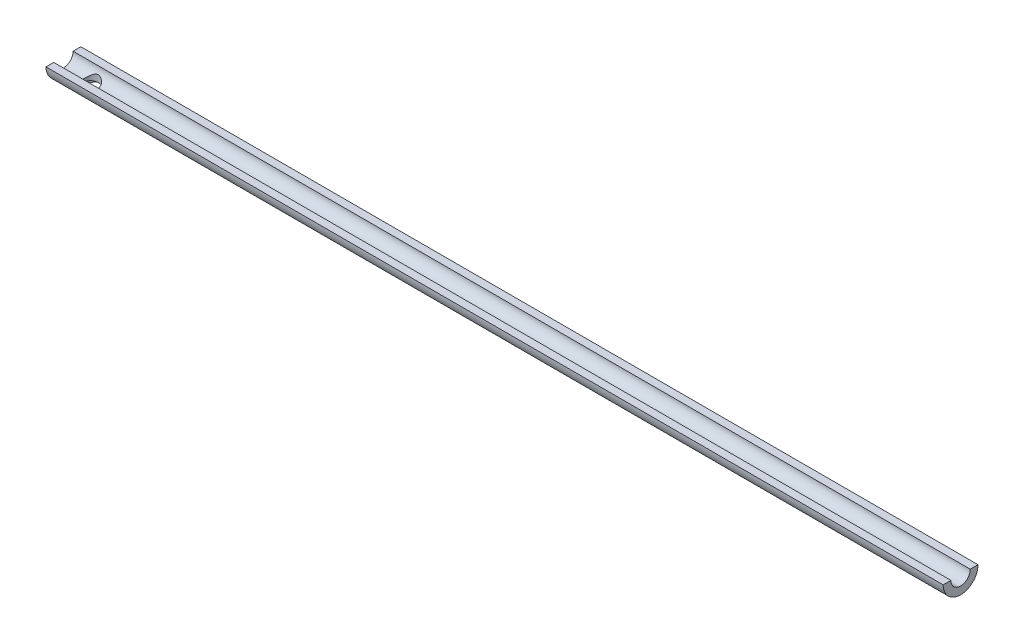
ISO-10303-21;
HEADER;
FILE_DESCRIPTION(('STEP AP214'),'2;1');
FILE_NAME('part.step','',(''),(''),'','','');
FILE_SCHEMA(('AUTOMOTIVE_DESIGN { 1 0 10303 214 1 1 1 1 }'));
ENDSEC;
DATA;
#1=APPLICATION_CONTEXT('core data for automotive mechanical design processes');
#2=APPLICATION_PROTOCOL_DEFINITION('international standard','automotive_design',2000,#1);
#3=PRODUCT_CONTEXT('',#1,'mechanical');
#4=PRODUCT('Part','Part','',(#3));
#5=PRODUCT_RELATED_PRODUCT_CATEGORY('part','',(#4));
#6=PRODUCT_DEFINITION_FORMATION('','',#4);
#7=PRODUCT_DEFINITION_CONTEXT('part definition',#1,'design');
#8=PRODUCT_DEFINITION('design','',#6,#7);
#9=PRODUCT_DEFINITION_SHAPE('','',#8);
#10=(LENGTH_UNIT() NAMED_UNIT(*) SI_UNIT(.MILLI.,.METRE.));
#11=(NAMED_UNIT(*) PLANE_ANGLE_UNIT() SI_UNIT($,.RADIAN.));
#12=(NAMED_UNIT(*) SI_UNIT($,.STERADIAN.) SOLID_ANGLE_UNIT());
#13=UNCERTAINTY_MEASURE_WITH_UNIT(LENGTH_MEASURE(1.E-05),#10,'distance_accuracy_value','');
#14=(GEOMETRIC_REPRESENTATION_CONTEXT(3) GLOBAL_UNCERTAINTY_ASSIGNED_CONTEXT((#13)) GLOBAL_UNIT_ASSIGNED_CONTEXT((#10,
#11,#12)) REPRESENTATION_CONTEXT('',''));
#15=CARTESIAN_POINT('',(0.,0.,0.));
#16=DIRECTION('',(0.,0.,1.));
#17=DIRECTION('',(1.,0.,0.));
#18=AXIS2_PLACEMENT_3D('',#15,#16,#17);
#19=CARTESIAN_POINT('',(735.584,15.875,0.));
#20=DIRECTION('',(-1.,0.,0.));
#21=DIRECTION('',(0.,0.,1.));
#22=AXIS2_PLACEMENT_3D('',#19,#20,#21);
#23=PLANE('',#22);
#24=CARTESIAN_POINT('',(735.584,15.875,-19.05));
#25=DIRECTION('',(-1.,0.,0.));
#26=DIRECTION('',(0.,0.,1.));
#27=AXIS2_PLACEMENT_3D('',#24,#25,#26);
#28=CIRCLE('',#27,14.2875);
#29=CARTESIAN_POINT('',(735.584,15.875,-33.3375));
#30=VERTEX_POINT('',#29);
#31=CARTESIAN_POINT('',(735.584,15.875,-4.7625));
#32=VERTEX_POINT('',#31);
#33=EDGE_CURVE('E65',#30,#32,#28,.T.);
#34=ORIENTED_EDGE('',*,*,#33,.F.);
#35=DIRECTION('',(0.,0.,-1.));
#36=VECTOR('',#35,1.);
#37=CARTESIAN_POINT('',(735.584,15.875,0.));
#38=LINE('',#37,#36);
#39=CARTESIAN_POINT('',(735.584,15.875,-26.9875));
#40=VERTEX_POINT('',#39);
#41=EDGE_CURVE('E105',#40,#30,#38,.T.);
#42=ORIENTED_EDGE('',*,*,#41,.F.);
#43=CARTESIAN_POINT('',(735.584,15.875,-19.05));
#44=DIRECTION('',(1.,0.,0.));
#45=DIRECTION('',(0.,0.,-1.));
#46=AXIS2_PLACEMENT_3D('',#43,#44,#45);
#47=CIRCLE('',#46,7.9375);
#48=CARTESIAN_POINT('',(735.584,15.875,-11.1125));
#49=VERTEX_POINT('',#48);
#50=EDGE_CURVE('E116',#49,#40,#47,.T.);
#51=ORIENTED_EDGE('',*,*,#50,.F.);
#52=EDGE_CURVE('E103',#32,#49,#38,.T.);
#53=ORIENTED_EDGE('',*,*,#52,.F.);
#54=EDGE_LOOP('',(#34,#42,#51,#53));
#55=FACE_BOUND('',#54,.T.);
#56=ADVANCED_FACE('F37',(#55),#23,.F.);
#57=CARTESIAN_POINT('',(0.,15.875,0.));
#58=DIRECTION('',(0.,-1.,0.));
#59=DIRECTION('',(0.,0.,-1.));
#60=AXIS2_PLACEMENT_3D('',#57,#58,#59);
#61=PLANE('',#60);
#62=DIRECTION('',(-1.,0.,0.));
#63=VECTOR('',#62,1.);
#64=CARTESIAN_POINT('',(735.584,15.875,-33.3375));
#65=LINE('',#64,#63);
#66=CARTESIAN_POINT('',(0.,15.875,-33.3375));
#67=VERTEX_POINT('',#66);
#68=EDGE_CURVE('E86',#67,#30,#65,.F.);
#69=ORIENTED_EDGE('',*,*,#68,.F.);
#70=DIRECTION('',(0.,0.,1.));
#71=VECTOR('',#70,1.);
#72=CARTESIAN_POINT('',(0.,15.875,0.));
#73=LINE('',#72,#71);
#74=CARTESIAN_POINT('',(0.,15.875,-26.9875));
#75=VERTEX_POINT('',#74);
#76=EDGE_CURVE('E106',#67,#75,#73,.T.);
#77=ORIENTED_EDGE('',*,*,#76,.T.);
#78=DIRECTION('',(1.,0.,0.));
#79=VECTOR('',#78,1.);
#80=CARTESIAN_POINT('',(0.,15.875,-26.9875));
#81=LINE('',#80,#79);
#82=EDGE_CURVE('E12',#75,#40,#81,.T.);
#83=ORIENTED_EDGE('',*,*,#82,.T.);
#84=ORIENTED_EDGE('',*,*,#41,.T.);
#85=EDGE_LOOP('',(#69,#77,#83,#84));
#86=FACE_BOUND('',#85,.T.);
#87=ADVANCED_FACE('F104',(#86),#61,.F.);
#88=DIRECTION('',(-1.,0.,0.));
#89=VECTOR('',#88,1.);
#90=CARTESIAN_POINT('',(735.584,15.875,-4.7625));
#91=LINE('',#90,#89);
#92=CARTESIAN_POINT('',(0.,15.875,-4.7625));
#93=VERTEX_POINT('',#92);
#94=EDGE_CURVE('E96',#32,#93,#91,.T.);
#95=ORIENTED_EDGE('',*,*,#94,.F.);
#96=ORIENTED_EDGE('',*,*,#52,.T.);
#97=DIRECTION('',(1.,0.,0.));
#98=VECTOR('',#97,1.);
#99=CARTESIAN_POINT('',(0.,15.875,-11.1125));
#100=LINE('',#99,#98);
#101=CARTESIAN_POINT('',(0.,15.875,-11.1125));
#102=VERTEX_POINT('',#101);
#103=EDGE_CURVE('E53',#49,#102,#100,.F.);
#104=ORIENTED_EDGE('',*,*,#103,.T.);
#105=EDGE_CURVE('E107',#102,#93,#73,.T.);
#106=ORIENTED_EDGE('',*,*,#105,.T.);
#107=EDGE_LOOP('',(#95,#96,#104,#106));
#108=FACE_BOUND('',#107,.T.);
#109=ADVANCED_FACE('F134',(#108),#61,.F.);
#110=CARTESIAN_POINT('',(22.225,5.5499,-19.05));
#111=DIRECTION('',(0.,-1.,0.));
#112=DIRECTION('',(0.,0.,-1.));
#113=AXIS2_PLACEMENT_3D('',#110,#111,#112);
#114=CYLINDRICAL_SURFACE('',#113,8.128);
#115=CARTESIAN_POINT('',(22.225,5.5499,-19.05));
#116=DIRECTION('',(0.,-1.,0.));
#117=DIRECTION('',(0.,0.,-1.));
#118=AXIS2_PLACEMENT_3D('',#115,#116,#117);
#119=CIRCLE('',#118,8.128);
#120=CARTESIAN_POINT('',(22.225,5.5499,-27.178));
#121=VERTEX_POINT('',#120);
#122=EDGE_CURVE('E180',#121,#121,#119,.T.);
#123=ORIENTED_EDGE('',*,*,#122,.F.);
#124=EDGE_LOOP('',(#123));
#125=FACE_BOUND('',#124,.T.);
#126=CARTESIAN_POINT('',(22.225,4.12475437490772,-27.178));
#127=CARTESIAN_POINT('',(22.0180147532059,4.1247532803757,-27.1779992237774));
#128=CARTESIAN_POINT('',(21.8110182894372,4.11926483692695,-27.1700813911082));
#129=CARTESIAN_POINT('',(21.3987922198779,4.09754245588704,-27.1385418085654));
#130=CARTESIAN_POINT('',(21.1935627571081,4.08130765661839,-27.1149187993993));
#131=CARTESIAN_POINT('',(20.7863878615931,4.03874877782049,-27.0523271400779));
#132=CARTESIAN_POINT('',(20.5844447959058,4.01241773491488,-27.0133478982228));
#133=CARTESIAN_POINT('',(20.1853282556612,3.95067075075943,-26.920586092574));
#134=CARTESIAN_POINT('',(19.988157024114,3.91525062456957,-26.8667967088247));
#135=CARTESIAN_POINT('',(19.6012008031054,3.83685509724765,-26.745511165725));
#136=CARTESIAN_POINT('',(19.4113740403267,3.79393385173565,-26.6781127509178));
#137=CARTESIAN_POINT('',(19.0385167877705,3.7016974888775,-26.5300382259267));
#138=CARTESIAN_POINT('',(18.8554888516306,3.6523799997255,-26.4493571873782));
#139=CARTESIAN_POINT('',(18.4970035159903,3.54873604210493,-26.2753794395942));
#140=CARTESIAN_POINT('',(18.3215461204565,3.49440957101198,-26.1820827237488));
#141=CARTESIAN_POINT('',(17.9788353795059,3.38212322601149,-25.9835226420731));
#142=CARTESIAN_POINT('',(17.8115823141774,3.32416322821229,-25.8782588681046));
#143=CARTESIAN_POINT('',(17.2873582640215,3.13391765196363,-25.5210848460265));
#144=CARTESIAN_POINT('',(16.946984312011,2.99695023811273,-25.2464934731679));
#145=CARTESIAN_POINT('',(16.472669066792,2.79305720220681,-24.7965425661813));
#146=CARTESIAN_POINT('',(16.3205174293569,2.72530880154062,-24.6401003216129));
#147=CARTESIAN_POINT('',(16.0288266458558,2.59177681487287,-24.3149290275969));
#148=CARTESIAN_POINT('',(15.8892896853653,2.52599357066447,-24.1461978581212));
#149=CARTESIAN_POINT('',(15.6112113719546,2.39188965528202,-23.7807265060997));
#150=CARTESIAN_POINT('',(15.4740014746693,2.32391350337649,-23.5828450606214));
#151=CARTESIAN_POINT('',(15.2169626423935,2.19404365322446,-23.1743177307861));
#152=CARTESIAN_POINT('',(15.0971260526265,2.13214728009375,-22.963677526368));
#153=CARTESIAN_POINT('',(14.8760572788859,2.01619860561373,-22.5308687873104));
#154=CARTESIAN_POINT('',(14.7748183059184,1.96214344338009,-22.3087044976281));
#155=CARTESIAN_POINT('',(14.592178921927,1.86349332974293,-21.8543445193544));
#156=CARTESIAN_POINT('',(14.5107756478608,1.81889701319039,-21.6221502841663));
#157=CARTESIAN_POINT('',(14.375223971502,1.74402848766091,-21.170385845118));
#158=CARTESIAN_POINT('',(14.3193106352917,1.71284266792939,-20.9514960729174));
#159=CARTESIAN_POINT('',(14.2257583035214,1.66040767567717,-20.5086681999183));
#160=CARTESIAN_POINT('',(14.1881183305758,1.63915797170662,-20.2847303697953));
#161=CARTESIAN_POINT('',(14.1317025233993,1.60723228622229,-19.8338970737274));
#162=CARTESIAN_POINT('',(14.1129137486965,1.59654905138997,-19.6070037451223));
#163=CARTESIAN_POINT('',(14.0944574588793,1.58605556350154,-19.152197221018));
#164=CARTESIAN_POINT('',(14.0947882780549,1.58624436326758,-18.9242841160921));
#165=CARTESIAN_POINT('',(14.1134480106352,1.59685216207865,-18.4950597861182));
#166=CARTESIAN_POINT('',(14.1297567730494,1.60612288849519,-18.2936283829412));
#167=CARTESIAN_POINT('',(14.1772302026522,1.63300272114614,-17.8930847861401));
#168=CARTESIAN_POINT('',(14.2083948904262,1.6506118389348,-17.6939725957299));
#169=CARTESIAN_POINT('',(14.285205100033,1.6937586086349,-17.2994481376163));
#170=CARTESIAN_POINT('',(14.330850422873,1.71929615159389,-17.1040358191084));
#171=CARTESIAN_POINT('',(14.4361090438978,1.77772437070963,-16.7181404779157));
#172=CARTESIAN_POINT('',(14.4957228984782,1.81061533976627,-16.5276576519185));
#173=CARTESIAN_POINT('',(14.6289037163109,1.883366444814,-16.151044574491));
#174=CARTESIAN_POINT('',(14.7025895729946,1.92328572021973,-15.9649678088723));
#175=CARTESIAN_POINT('',(14.8628859216692,2.00905516258062,-15.5998607105857));
#176=CARTESIAN_POINT('',(14.9495007436819,2.05490731581992,-15.420832764111));
#177=CARTESIAN_POINT('',(15.2276890928379,2.20000547802107,-14.8956302559676));
#178=CARTESIAN_POINT('',(15.4376919804277,2.30684115966405,-14.5610979019035));
#179=CARTESIAN_POINT('',(15.9273094610793,2.54539424455193,-13.8930550781077));
#180=CARTESIAN_POINT('',(16.2120962339968,2.67855865345796,-13.5638891046657));
#181=CARTESIAN_POINT('',(16.8300430009505,2.94841747384691,-12.9551675557189));
#182=CARTESIAN_POINT('',(17.1632609297996,3.08511594956813,-12.6756723006394));
#183=CARTESIAN_POINT('',(17.7123785400368,3.28931712151679,-12.285552451061));
#184=CARTESIAN_POINT('',(17.9135239179696,3.3602555712769,-12.1555659656631));
#185=CARTESIAN_POINT('',(18.3279364553059,3.49690988125253,-11.9131328407156));
#186=CARTESIAN_POINT('',(18.5412052632069,3.56262502829579,-11.8006885943137));
#187=CARTESIAN_POINT('',(18.9784190779849,3.68628936956866,-11.5946376821911));
#188=CARTESIAN_POINT('',(19.2023480558645,3.74424975339225,-11.5010037743509));
#189=CARTESIAN_POINT('',(19.6597889977331,3.85006144936678,-11.3335671871596));
#190=CARTESIAN_POINT('',(19.8932976168246,3.89791625477487,-11.2597576525893));
#191=CARTESIAN_POINT('',(20.3141247550129,3.97176227899168,-11.147531505603));
#192=CARTESIAN_POINT('',(20.4998869661831,4.00025064127314,-11.1048837500096));
#193=CARTESIAN_POINT('',(20.8749901106291,4.04891667287766,-11.032624119537));
#194=CARTESIAN_POINT('',(21.0643303425699,4.06909595356551,-11.0030097170471));
#195=CARTESIAN_POINT('',(21.4452238519753,4.10043715333412,-10.9572193397773));
#196=CARTESIAN_POINT('',(21.6367752842204,4.11160610746744,-10.9410328804927));
#197=CARTESIAN_POINT('',(22.0208703931804,4.12454872876364,-10.922289176426));
#198=CARTESIAN_POINT('',(22.2134140953366,4.12632215381884,-10.9197322828558));
#199=CARTESIAN_POINT('',(22.5981461721252,4.12040541837536,-10.9282890627355));
#200=CARTESIAN_POINT('',(22.7903343200902,4.11271051065841,-10.9394095937503));
#201=CARTESIAN_POINT('',(23.1728480072731,4.08813218458613,-10.9751705709717));
#202=CARTESIAN_POINT('',(23.3631735398583,4.0712487335235,-10.9998110653035));
#203=CARTESIAN_POINT('',(23.7407450063913,4.02888080940674,-11.062288437456));
#204=CARTESIAN_POINT('',(23.9279896141035,4.00339272894072,-11.1001308502822));
#205=CARTESIAN_POINT('',(24.2982642769525,3.94464973717565,-11.1885617223697));
#206=CARTESIAN_POINT('',(24.4812926013519,3.91139169667847,-11.2391553175666));
#207=CARTESIAN_POINT('',(24.844494847235,3.83764193152166,-11.3532904310791));
#208=CARTESIAN_POINT('',(25.0246000490354,3.79706122163712,-11.4169927594608));
#209=CARTESIAN_POINT('',(25.3787080656639,3.71010547664289,-11.5563533307756));
#210=CARTESIAN_POINT('',(25.5527088431555,3.6637285301769,-11.6320155197594));
#211=CARTESIAN_POINT('',(26.0645284851636,3.51767962655346,-11.8760720749144));
#212=CARTESIAN_POINT('',(26.3923325093595,3.41105365305769,-12.061589808659));
#213=CARTESIAN_POINT('',(27.0686900250849,3.17013197155076,-12.508338747979));
#214=CARTESIAN_POINT('',(27.4117498844501,3.03417303350307,-12.7770107658701));
#215=CARTESIAN_POINT('',(27.8909516798366,2.83082797521136,-13.2183070688705));
#216=CARTESIAN_POINT('',(28.0448883261136,2.76309531190179,-13.3719150091513));
#217=CARTESIAN_POINT('',(28.3403524753679,2.6293049873683,-13.6914386250406));
#218=CARTESIAN_POINT('',(28.4818779387584,2.56324760271373,-13.8573563153278));
#219=CARTESIAN_POINT('',(28.7648784244889,2.42801685551445,-14.2176239858584));
#220=CARTESIAN_POINT('',(28.9049937562794,2.35917096368468,-14.4131675097714));
#221=CARTESIAN_POINT('',(29.1680510426809,2.22724240655099,-14.8172109410428));
#222=CARTESIAN_POINT('',(29.2910003725608,2.16415727022872,-15.0257052282056));
#223=CARTESIAN_POINT('',(29.5185153802836,2.04553079179035,-15.4544625311531));
#224=CARTESIAN_POINT('',(29.623087585257,1.9899867728441,-15.6747213320632));
#225=CARTESIAN_POINT('',(29.8126114017301,1.88808715215838,-16.1255674144062));
#226=CARTESIAN_POINT('',(29.8975657204929,1.84173028272008,-16.356153265459));
#227=CARTESIAN_POINT('',(30.0405319279167,1.76303511449334,-16.8065627144205));
#228=CARTESIAN_POINT('',(30.1001807373834,1.72985955165364,-17.0257206954869));
#229=CARTESIAN_POINT('',(30.2010980032451,1.6734276457378,-17.4694910599292));
#230=CARTESIAN_POINT('',(30.2423673439576,1.65017082542945,-17.694103180334));
#231=CARTESIAN_POINT('',(30.3058771817978,1.61427905051082,-18.1466803103593));
#232=CARTESIAN_POINT('',(30.328131386229,1.6016364446235,-18.3746427840472));
#233=CARTESIAN_POINT('',(30.3533008556728,1.58733273321917,-18.8319685103891));
#234=CARTESIAN_POINT('',(30.3562179535954,1.58567058689532,-19.0613316282171));
#235=CARTESIAN_POINT('',(30.3434555646966,1.59292805827617,-19.4929113254883));
#236=CARTESIAN_POINT('',(30.329877594262,1.6006519084853,-19.6952143027216));
#237=CARTESIAN_POINT('',(30.2877260874705,1.62454313495614,-20.0977497224463));
#238=CARTESIAN_POINT('',(30.259152613769,1.64071047593858,-20.2979821735855));
#239=CARTESIAN_POINT('',(30.1873597538179,1.6811081377679,-20.6949623606104));
#240=CARTESIAN_POINT('',(30.1441407301919,1.70533825898019,-20.8917101826484));
#241=CARTESIAN_POINT('',(30.0435525296171,1.76130836593261,-21.2804571592908));
#242=CARTESIAN_POINT('',(29.9861828292883,1.79304862944265,-21.4724561379644));
#243=CARTESIAN_POINT('',(29.8577103118146,1.86344616022037,-21.8511049285758));
#244=CARTESIAN_POINT('',(29.7865700609654,1.90212226021264,-22.0377385298514));
#245=CARTESIAN_POINT('',(29.6313250934355,1.9855200799614,-22.4041579276078));
#246=CARTESIAN_POINT('',(29.547216049953,2.03024381678706,-22.5839414136153));
#247=CARTESIAN_POINT('',(29.2764762262614,2.17215934525449,-23.1116732419864));
#248=CARTESIAN_POINT('',(29.0713476266087,2.27714337546833,-23.448251074376));
#249=CARTESIAN_POINT('',(28.5924271313372,2.51221039405393,-24.1204134915682));
#250=CARTESIAN_POINT('',(28.3135686743286,2.64378358838054,-24.4518300479086));
#251=CARTESIAN_POINT('',(27.7075374404192,2.91149202465902,-25.066008590855));
#252=CARTESIAN_POINT('',(27.380307034293,3.04763255637928,-25.3487116591085));
#253=CARTESIAN_POINT('',(26.8397096345114,3.25231241551686,-25.7452001411438));
#254=CARTESIAN_POINT('',(26.6410517451605,3.32379995190781,-25.8779005695173));
#255=CARTESIAN_POINT('',(26.2314938118909,3.46197839661398,-26.1259932134789));
#256=CARTESIAN_POINT('',(26.0205920153576,3.52866861515832,-26.2413829426684));
#257=CARTESIAN_POINT('',(25.5879373800307,3.65473552688157,-26.4535817018082));
#258=CARTESIAN_POINT('',(25.3662003977546,3.71412248496211,-26.5504169199846));
#259=CARTESIAN_POINT('',(24.9129075625092,3.82324468480013,-26.7245307380687));
#260=CARTESIAN_POINT('',(24.6813552048321,3.87298332775522,-26.801816232523));
#261=CARTESIAN_POINT('',(24.2671813550624,3.9499023117823,-26.9194578131634));
#262=CARTESIAN_POINT('',(24.0862738513112,3.97962899667628,-26.9642247084879));
#263=CARTESIAN_POINT('',(23.7207562828793,4.03131583410353,-27.0413681658742));
#264=CARTESIAN_POINT('',(23.5361469383456,4.05327748203223,-27.073747113713));
#265=CARTESIAN_POINT('',(23.164458579354,4.08870874786635,-27.1257035236378));
#266=CARTESIAN_POINT('',(22.9773814513257,4.10218450749925,-27.1452902445796));
#267=CARTESIAN_POINT('',(22.6018727277906,4.1202082191966,-27.1714394195515));
#268=CARTESIAN_POINT('',(22.4134410124486,4.12475537137837,-27.1780007066792));
#269=CARTESIAN_POINT('',(22.225,4.12475437490772,-27.178));
#270=B_SPLINE_CURVE_WITH_KNOTS('',3,(#126,#127,#128,#129,#130,#131,#132,#133,#134,#135,#136,
#137,#138,#139,#140,#141,#142,#143,#144,#145,#146,#147,#148,#149,#150,#151,#152,#153,#154,#155,
#156,#157,#158,#159,#160,#161,#162,#163,#164,#165,#166,#167,#168,#169,#170,#171,#172,#173,#174,
#175,#176,#177,#178,#179,#180,#181,#182,#183,#184,#185,#186,#187,#188,#189,#190,#191,#192,#193,
#194,#195,#196,#197,#198,#199,#200,#201,#202,#203,#204,#205,#206,#207,#208,#209,#210,#211,#212,
#213,#214,#215,#216,#217,#218,#219,#220,#221,#222,#223,#224,#225,#226,#227,#228,#229,#230,#231,
#232,#233,#234,#235,#236,#237,#238,#239,#240,#241,#242,#243,#244,#245,#246,#247,#248,#249,#250,
#251,#252,#253,#254,#255,#256,#257,#258,#259,#260,#261,#262,#263,#264,#265,#266,#267,#268,#269),
.UNSPECIFIED.,.T.,.F.,(4,2,2,2,2,2,2,2,2,2,2,2,2,2,2,2,2,2,2,2,2,2,2,2,2,2,2,2,2,2,2,2,2,2,2,2,
2,2,2,2,2,2,2,2,2,2,2,2,2,2,2,2,2,2,2,2,2,2,2,2,2,2,2,2,2,2,2,2,2,2,2,4),(0.,0.620754127397335,
1.24155803489433,1.86279088308009,2.48431028401051,3.10151510056483,3.71894944213898,
4.33638410720971,4.95383983629194,6.32207699198678,7.0070909176564,7.69222329994257,
8.44188180863365,9.19120900314588,9.94026211248618,10.6892070409743,11.3724245891144,
12.0556055900344,12.7383172974124,13.4209695266473,14.0271565984417,14.6333445102122,
15.2395240921138,15.8457278235166,16.457300101753,17.069077662278,18.2918655983163,
19.6521467844397,21.0140687809612,21.7625974992275,22.5112282441642,23.2587668400916,
24.0060466052428,24.5835815681624,25.161004477988,25.737976111966,26.3149626135041,
26.8922385215696,27.4695164845053,28.0470367670997,28.624790036755,29.2101056428332,
29.7956147733005,30.9660989876605,32.329617069885,33.0123866851701,33.6952682936899,
34.4449625332793,35.1943336735009,35.943438114087,36.6924391166014,37.3800868041914,
38.0677014024412,38.7548199057505,39.4418732780968,40.0498584890229,40.6578411596363,
41.2658087777079,41.8737988855684,42.4834655652482,43.0933360910135,44.3122855860784,
45.6650948400749,47.0195289870142,47.7668485354288,48.5142753215082,49.2606392749048,
50.0067396420717,50.5723472476314,51.1378458687382,51.7029347339975,52.2680742212807),.UNSPECIFIED.);
#271=CARTESIAN_POINT('',(22.225,4.12475437490772,-27.178));
#272=VERTEX_POINT('',#271);
#273=EDGE_CURVE('E136',#272,#272,#270,.T.);
#274=ORIENTED_EDGE('',*,*,#273,.F.);
#275=EDGE_LOOP('',(#274));
#276=FACE_BOUND('',#275,.T.);
#277=ADVANCED_FACE('F129',(#125,#276),#114,.F.);
#278=CARTESIAN_POINT('',(22.225,15.875,-19.05));
#279=DIRECTION('',(0.,-1.,0.));
#280=DIRECTION('',(0.,0.,-1.));
#281=AXIS2_PLACEMENT_3D('',#278,#279,#280);
#282=CYLINDRICAL_SURFACE('',#281,6.35);
#283=CARTESIAN_POINT('',(22.225,11.1125,-25.4));
#284=CARTESIAN_POINT('',(22.1057591384843,11.1124972219549,-25.3999988458941));
#285=CARTESIAN_POINT('',(21.9864748221275,11.1079993597814,-25.3966322226424));
#286=CARTESIAN_POINT('',(21.7488907056395,11.0902297345786,-25.3832454421482));
#287=CARTESIAN_POINT('',(21.6305916325855,11.0769519886551,-25.373220747862));
#288=CARTESIAN_POINT('',(21.3956326538325,11.0422244649837,-25.3467183488856));
#289=CARTESIAN_POINT('',(21.2789776740302,11.0207540188557,-25.3302243205294));
#290=CARTESIAN_POINT('',(21.0482322748224,10.9705645850597,-25.2911079734667));
#291=CARTESIAN_POINT('',(20.9341436187361,10.9418407698869,-25.2684815726006));
#292=CARTESIAN_POINT('',(20.6698149950906,10.8671250091594,-25.2085803850203));
#293=CARTESIAN_POINT('',(20.5208230817188,10.8186030878779,-25.1689484172837));
#294=CARTESIAN_POINT('',(20.2289745443959,10.7129272316712,-25.0800639867922));
#295=CARTESIAN_POINT('',(20.0861181200141,10.6557730162358,-25.0308112113897));
#296=CARTESIAN_POINT('',(19.8062660642576,10.5349899459523,-24.9232234692227));
#297=CARTESIAN_POINT('',(19.669285792068,10.4713454366179,-24.8648663544885));
#298=CARTESIAN_POINT('',(19.4015035032551,10.3396631652094,-24.7396585029541));
#299=CARTESIAN_POINT('',(19.2707013299446,10.2716255146565,-24.67280798172));
#300=CARTESIAN_POINT('',(18.9689123311058,10.1076666116393,-24.5052741617836));
#301=CARTESIAN_POINT('',(18.8004994083019,10.0105595449506,-24.4010983926801));
#302=CARTESIAN_POINT('',(18.4747411758871,9.81455900031779,-24.1780631831489));
#303=CARTESIAN_POINT('',(18.3173998706645,9.71566489212355,-24.0591984724233));
#304=CARTESIAN_POINT('',(18.0141745830674,9.51896622305511,-23.8071297364857));
#305=CARTESIAN_POINT('',(17.8682815003554,9.42116085091244,-23.6739373044144));
#306=CARTESIAN_POINT('',(17.5884520150845,9.22905033185359,-23.3932895774403));
#307=CARTESIAN_POINT('',(17.4545116369805,9.13474402726844,-23.2458390591218));
#308=CARTESIAN_POINT('',(17.2247252749737,8.9699959351478,-22.9673449195798));
#309=CARTESIAN_POINT('',(17.1265784648234,8.8985179083313,-22.838807636718));
#310=CARTESIAN_POINT('',(16.9392996888609,8.76050584730411,-22.5728278495661));
#311=CARTESIAN_POINT('',(16.8501659790643,8.69397085730703,-22.435387076528));
#312=CARTESIAN_POINT('',(16.6818224419905,8.5671160758903,-22.1520641335981));
#313=CARTESIAN_POINT('',(16.6026009502199,8.50678899426989,-22.0061921867114));
#314=CARTESIAN_POINT('',(16.4548972991769,8.39347292260139,-21.7063744157807));
#315=CARTESIAN_POINT('',(16.3864133583647,8.34048271541368,-21.5524299367735));
#316=CARTESIAN_POINT('',(16.2712998867497,8.25090222497836,-21.2627288912534));
#317=CARTESIAN_POINT('',(16.2229271245307,8.21304556414684,-21.1280548308056));
#318=CARTESIAN_POINT('',(16.1350073540434,8.1439796234637,-20.8542062924032));
#319=CARTESIAN_POINT('',(16.0954586643362,8.11276907723781,-20.7150326776414));
#320=CARTESIAN_POINT('',(16.0257319046027,8.05759142155982,-20.4329925890225));
#321=CARTESIAN_POINT('',(15.9955506797095,8.03362187348591,-20.2901273760563));
#322=CARTESIAN_POINT('',(15.9449979075001,7.99340132029282,-20.0015900671859));
#323=CARTESIAN_POINT('',(15.9246264773177,7.97715040733795,-19.8559179377874));
#324=CARTESIAN_POINT('',(15.8939742252697,7.95267660979672,-19.5623202973743));
#325=CARTESIAN_POINT('',(15.8837290807651,7.94448211044445,-19.4143886706816));
#326=CARTESIAN_POINT('',(15.8736317234484,7.93640591835768,-19.1179425051374));
#327=CARTESIAN_POINT('',(15.8737795306279,7.93652424161364,-18.9694279651653));
#328=CARTESIAN_POINT('',(15.8844657647045,7.94507122345287,-18.6730105441203));
#329=CARTESIAN_POINT('',(15.8950045434275,7.95350016342383,-18.5251076839286));
#330=CARTESIAN_POINT('',(15.9262904810444,7.97847801465032,-18.2310877763495));
#331=CARTESIAN_POINT('',(15.9470374044877,7.99502673862313,-18.0849706878529));
#332=CARTESIAN_POINT('',(15.9969907893957,8.03476476708318,-17.8035288449841));
#333=CARTESIAN_POINT('',(16.0256710532915,8.05754022627937,-17.6680516176092));
#334=CARTESIAN_POINT('',(16.0914535840831,8.10960253530147,-17.400416540722));
#335=CARTESIAN_POINT('',(16.1285587103399,8.1388915957453,-17.2682598351326));
#336=CARTESIAN_POINT('',(16.2518278800462,8.23578674342528,-16.8778934421997));
#337=CARTESIAN_POINT('',(16.3499812030746,8.31244938670406,-16.6255922490497));
#338=CARTESIAN_POINT('',(16.5849425790291,8.49357006379646,-16.1177567955594));
#339=CARTESIAN_POINT('',(16.7245634348964,8.59999424128749,-15.8642523230182));
#340=CARTESIAN_POINT('',(17.0323997031645,8.82985693419508,-15.3838163607941));
#341=CARTESIAN_POINT('',(17.2006311227357,8.9533049668444,-15.1568998673721));
#342=CARTESIAN_POINT('',(17.599247533671,9.23757648369878,-14.6866782205678));
#343=CARTESIAN_POINT('',(17.8352964950782,9.40085954638908,-14.4496328536501));
#344=CARTESIAN_POINT('',(18.2134644245732,9.64885681800549,-14.1247852202108));
#345=CARTESIAN_POINT('',(18.3436715236388,9.73211536165979,-14.0215391926606));
#346=CARTESIAN_POINT('',(18.6120364616535,9.89806459791115,-13.8253838447953));
#347=CARTESIAN_POINT('',(18.750193345466,9.98075535739463,-13.7324732866306));
#348=CARTESIAN_POINT('',(19.0207172231311,10.1358559433147,-13.5656739544279));
#349=CARTESIAN_POINT('',(19.1523596374472,10.2084887250832,-13.4908149565788));
#350=CARTESIAN_POINT('',(19.4222204839244,10.3501671307733,-13.3499914110003));
#351=CARTESIAN_POINT('',(19.5604396658711,10.4192123438073,-13.284027880703));
#352=CARTESIAN_POINT('',(19.8433344682341,10.5516401770166,-13.1615478674818));
#353=CARTESIAN_POINT('',(19.9879986018397,10.6150323113207,-13.1050153669272));
#354=CARTESIAN_POINT('',(20.2838916089167,10.7338991642908,-13.0019283687376));
#355=CARTESIAN_POINT('',(20.4351174417561,10.7893775001025,-12.9553693076468));
#356=CARTESIAN_POINT('',(20.8050750302486,10.909488067719,-12.856790901728));
#357=CARTESIAN_POINT('',(21.0269350008432,10.9691190991629,-12.8098438723878));
#358=CARTESIAN_POINT('',(21.3664756142304,11.0370120991732,-12.7572595239636));
#359=CARTESIAN_POINT('',(21.4807187070347,11.0560464606787,-12.7427070978371));
#360=CARTESIAN_POINT('',(21.7108427999921,11.0861810382376,-12.7197958167764));
#361=CARTESIAN_POINT('',(21.8267229997876,11.0972850031914,-12.7114340352982));
#362=CARTESIAN_POINT('',(22.0599834113241,11.1110734118982,-12.7010642058163));
#363=CARTESIAN_POINT('',(22.1773684632081,11.1137058814102,-12.6990953791486));
#364=CARTESIAN_POINT('',(22.4119367053587,11.1102754878997,-12.701668656824));
#365=CARTESIAN_POINT('',(22.5291198988202,11.1042127637899,-12.7062106571513));
#366=CARTESIAN_POINT('',(22.7624286286122,11.0836834457076,-12.7217020603789));
#367=CARTESIAN_POINT('',(22.8785529846686,11.0692084186486,-12.7326578930387));
#368=CARTESIAN_POINT('',(23.1088555865426,11.0325145270898,-12.7607416573147));
#369=CARTESIAN_POINT('',(23.2230327388028,11.0102914523313,-12.777872944821));
#370=CARTESIAN_POINT('',(23.4774218722534,10.9525028875428,-12.823075168888));
#371=CARTESIAN_POINT('',(23.6168924813598,10.9149829450432,-12.8528186884582));
#372=CARTESIAN_POINT('',(23.891099520446,10.8311707927761,-12.9208402097144));
#373=CARTESIAN_POINT('',(24.0258319605229,10.7848713902393,-12.9591252137757));
#374=CARTESIAN_POINT('',(24.2904860170597,10.6853406939884,-13.0437021656338));
#375=CARTESIAN_POINT('',(24.4203954892771,10.632093249229,-13.0900128544685));
#376=CARTESIAN_POINT('',(24.6749685412999,10.5204998989995,-13.1900635829332));
#377=CARTESIAN_POINT('',(24.7996336408536,10.4621554858521,-13.2438014506513));
#378=CARTESIAN_POINT('',(25.0997979426272,10.31426122627,-13.384602120324));
#379=CARTESIAN_POINT('',(25.2724245021782,10.2226593973931,-13.4756543649093));
#380=CARTESIAN_POINT('',(25.6070500128911,10.035440516892,-13.6720921009435));
#381=CARTESIAN_POINT('',(25.7690445595234,9.93982182776937,-13.7774834778029));
#382=CARTESIAN_POINT('',(26.0825519969922,9.74745639829163,-14.0023242549401));
#383=CARTESIAN_POINT('',(26.2340543941688,9.6507086385288,-14.1217874155795));
#384=CARTESIAN_POINT('',(26.5260896306543,9.45871705837796,-14.3744890206292));
#385=CARTESIAN_POINT('',(26.6666241816978,9.36347300516712,-14.5077253079136));
#386=CARTESIAN_POINT('',(26.9380504997915,9.1754069890604,-14.7898921125293));
#387=CARTESIAN_POINT('',(27.0687750671124,9.08263935328997,-14.9390203072271));
#388=CARTESIAN_POINT('',(27.3172922119868,8.90323851781723,-15.2512030194205));
#389=CARTESIAN_POINT('',(27.4350827656831,8.81660627890547,-15.4142597093085));
#390=CARTESIAN_POINT('',(27.6560024910763,8.65199601724719,-15.753402670861));
#391=CARTESIAN_POINT('',(27.759171059199,8.57399486899366,-15.9294519094453));
#392=CARTESIAN_POINT('',(27.9495041145189,8.42868701323317,-16.2941347802323));
#393=CARTESIAN_POINT('',(28.0366776630869,8.36137425355324,-16.4827612042111));
#394=CARTESIAN_POINT('',(28.1679371759395,8.25930533821191,-16.8085411976495));
#395=CARTESIAN_POINT('',(28.2168523605264,8.22105056904939,-16.9426768003211));
#396=CARTESIAN_POINT('',(28.3059225755803,8.1511238480204,-17.2154828490856));
#397=CARTESIAN_POINT('',(28.3460798872378,8.11945018205531,-17.3541521034368));
#398=CARTESIAN_POINT('',(28.4170802762044,8.06329128564868,-17.6352069978433));
#399=CARTESIAN_POINT('',(28.4479282853632,8.03880224915142,-17.7775906265178));
#400=CARTESIAN_POINT('',(28.4998780705768,7.99748435424602,-18.0652349696616));
#401=CARTESIAN_POINT('',(28.5209795001576,7.98065576815389,-18.2104957862186));
#402=CARTESIAN_POINT('',(28.553150118331,7.9549750183341,-18.5033759159579));
#403=CARTESIAN_POINT('',(28.5641820064773,7.94615251209945,-18.6510019533693));
#404=CARTESIAN_POINT('',(28.575889915589,7.936788832081,-18.9469277200917));
#405=CARTESIAN_POINT('',(28.5765659776676,7.93624762542,-19.0952274467257));
#406=CARTESIAN_POINT('',(28.5675501276612,7.94345909763747,-19.3913166069886));
#407=CARTESIAN_POINT('',(28.5578575516261,7.95121230764449,-19.5391060073309));
#408=CARTESIAN_POINT('',(28.5282714716249,7.97483806869203,-19.8329959176992));
#409=CARTESIAN_POINT('',(28.5083781909919,7.99071044197257,-19.9790964646291));
#410=CARTESIAN_POINT('',(28.460054383025,8.02916627577007,-20.260741980603));
#411=CARTESIAN_POINT('',(28.4321409338752,8.05134258488209,-20.3964318663915));
#412=CARTESIAN_POINT('',(28.3678603290517,8.10224256435014,-20.6645593229208));
#413=CARTESIAN_POINT('',(28.3314902938922,8.13096846479139,-20.796995768837));
#414=CARTESIAN_POINT('',(28.2103691326562,8.22623984713279,-21.1882875515607));
#415=CARTESIAN_POINT('',(28.1135726801725,8.3019066317878,-21.4413202719508));
#416=CARTESIAN_POINT('',(27.8816507520017,8.48087040704626,-21.9500369931147));
#417=CARTESIAN_POINT('',(27.7437967431015,8.58608331614379,-22.2037766198138));
#418=CARTESIAN_POINT('',(27.4394933920737,8.8136852520537,-22.6849259779936));
#419=CARTESIAN_POINT('',(27.2730288675778,8.93608339198155,-22.912321622052));
#420=CARTESIAN_POINT('',(26.8785840116381,9.2181019376477,-23.3835303595262));
#421=CARTESIAN_POINT('',(26.6449864834486,9.38021324143599,-23.6211771689838));
#422=CARTESIAN_POINT('',(26.2706321701248,9.62681474290927,-23.947222545999));
#423=CARTESIAN_POINT('',(26.1417194950207,9.70966862244295,-24.0509181690198));
#424=CARTESIAN_POINT('',(25.8760048176365,9.87496758185915,-24.2480792684281));
#425=CARTESIAN_POINT('',(25.7392036904063,9.95741270598645,-24.3415458761787));
#426=CARTESIAN_POINT('',(25.4691438103369,10.1135120582993,-24.5108919386508));
#427=CARTESIAN_POINT('',(25.3364918615215,10.1873383601279,-24.5875822124682));
#428=CARTESIAN_POINT('',(25.0644541960524,10.3314825395802,-24.7318759305527));
#429=CARTESIAN_POINT('',(24.9250675822608,10.4017999472269,-24.7994781596216));
#430=CARTESIAN_POINT('',(24.6396291946371,10.5368288153116,-24.9250595507309));
#431=CARTESIAN_POINT('',(24.4935869070977,10.6015478956399,-24.983051894544));
#432=CARTESIAN_POINT('',(24.1947685264943,10.7230369171374,-25.0888461664442));
#433=CARTESIAN_POINT('',(24.0419958660816,10.7798108501993,-25.1366532182968));
#434=CARTESIAN_POINT('',(23.6660267534629,10.9035673752009,-25.2385053748773));
#435=CARTESIAN_POINT('',(23.4394748740142,10.9653000672875,-25.2871699237859));
#436=CARTESIAN_POINT('',(23.0927039816094,11.0354263127912,-25.3415251697116));
#437=CARTESIAN_POINT('',(22.9761072482384,11.0550456659685,-25.3565294604933));
#438=CARTESIAN_POINT('',(22.7411965863047,11.0860166213217,-25.3800816770978));
#439=CARTESIAN_POINT('',(22.6228839194248,11.0973740123245,-25.3886341236262));
#440=CARTESIAN_POINT('',(22.4577562239133,11.1070423223516,-25.3959036538931));
#441=CARTESIAN_POINT('',(22.4112474241326,11.1090866431282,-25.3974387855292));
#442=CARTESIAN_POINT('',(22.3181612990727,11.1118161130861,-25.3994872505401));
#443=CARTESIAN_POINT('',(22.2715839656612,11.1125010853021,-25.4000004508759));
#444=CARTESIAN_POINT('',(22.225,11.1125,-25.4));
#445=B_SPLINE_CURVE_WITH_KNOTS('',3,(#283,#284,#285,#286,#287,#288,#289,#290,#291,#292,#293,
#294,#295,#296,#297,#298,#299,#300,#301,#302,#303,#304,#305,#306,#307,#308,#309,#310,#311,#312,
#313,#314,#315,#316,#317,#318,#319,#320,#321,#322,#323,#324,#325,#326,#327,#328,#329,#330,#331,
#332,#333,#334,#335,#336,#337,#338,#339,#340,#341,#342,#343,#344,#345,#346,#347,#348,#349,#350,
#351,#352,#353,#354,#355,#356,#357,#358,#359,#360,#361,#362,#363,#364,#365,#366,#367,#368,#369,
#370,#371,#372,#373,#374,#375,#376,#377,#378,#379,#380,#381,#382,#383,#384,#385,#386,#387,#388,
#389,#390,#391,#392,#393,#394,#395,#396,#397,#398,#399,#400,#401,#402,#403,#404,#405,#406,#407,
#408,#409,#410,#411,#412,#413,#414,#415,#416,#417,#418,#419,#420,#421,#422,#423,#424,#425,#426,
#427,#428,#429,#430,#431,#432,#433,#434,#435,#436,#437,#438,#439,#440,#441,#442,#443,#444),
.UNSPECIFIED.,.T.,.F.,(4,2,2,2,2,2,2,2,2,2,2,2,2,2,2,2,2,2,2,2,2,2,2,2,2,2,2,2,2,2,2,2,2,2,2,2,
2,2,2,2,2,2,2,2,2,2,2,2,2,2,2,2,2,2,2,2,2,2,2,2,2,2,2,2,2,2,2,2,2,2,2,2,2,2,2,2,2,2,2,2,4),(0.,
0.357668750318978,0.71558147910576,1.07440317735413,1.43346432296719,1.91757926612675,
2.40170994419757,2.88703727092269,3.37235228230308,4.03317229531371,4.69423009846535,
5.35475698001817,6.01506334087384,6.545034847085,7.07490360976042,7.6041428491022,
8.13329418564114,8.57690985633359,9.02044092313476,9.46382245068566,9.90720927229786,
10.3521527433308,10.797097070252,11.2420564629812,11.6870055932105,12.1075586175981,
12.5282545897412,13.3690516893644,14.2908429234326,15.2131515924553,16.3255326519232,
16.8827844560525,17.4399694477145,17.9434728609244,18.4470338143096,18.9497306168303,
19.4521969113071,20.1525709534004,20.5023880343401,20.852039638183,21.2038323718213,
21.5556194853473,21.9077598649233,22.2600918952102,22.7017834416316,23.143838429546,
23.5869399367869,24.0299121420028,24.6757964574933,25.3219466765716,25.9687340749515,
26.6154203275197,27.2713811629228,27.927444494346,28.5817051302216,29.2355939674264,
29.6786070515884,30.1215046045656,30.564167107253,31.0068453446122,31.4511568108172,
31.8954665130815,32.3398046681838,32.7841330954169,33.2045485638871,33.6251073949144,
34.4656321245628,35.3843722551849,36.303601435453,37.4109798420038,37.9657320437798,
38.5204228259711,39.0302975043635,39.5402402924421,40.0494777014077,40.5584583277104,
41.2745980097557,41.6317719930597,41.9886954771385,42.1284081554906,42.2681390209939),.UNSPECIFIED.);
#446=CARTESIAN_POINT('',(22.225,11.1125,-25.4));
#447=VERTEX_POINT('',#446);
#448=EDGE_CURVE('E114',#447,#447,#445,.T.);
#449=ORIENTED_EDGE('',*,*,#448,.T.);
#450=EDGE_LOOP('',(#449));
#451=FACE_BOUND('',#450,.T.);
#452=CARTESIAN_POINT('',(22.225,5.5499,-19.05));
#453=DIRECTION('',(0.,-1.,0.));
#454=DIRECTION('',(0.,0.,-1.));
#455=AXIS2_PLACEMENT_3D('',#452,#453,#454);
#456=CIRCLE('',#455,6.35);
#457=CARTESIAN_POINT('',(22.225,5.5499,-25.4));
#458=VERTEX_POINT('',#457);
#459=EDGE_CURVE('E123',#458,#458,#456,.T.);
#460=ORIENTED_EDGE('',*,*,#459,.T.);
#461=EDGE_LOOP('',(#460));
#462=FACE_BOUND('',#461,.T.);
#463=ADVANCED_FACE('F122',(#451,#462),#282,.F.);
#464=CARTESIAN_POINT('',(0.,15.875,-19.05));
#465=DIRECTION('',(1.,0.,0.));
#466=DIRECTION('',(0.,0.,-1.));
#467=AXIS2_PLACEMENT_3D('',#464,#465,#466);
#468=CYLINDRICAL_SURFACE('',#467,7.9375);
#469=CARTESIAN_POINT('',(0.,15.875,-19.05));
#470=DIRECTION('',(1.,0.,0.));
#471=DIRECTION('',(0.,0.,-1.));
#472=AXIS2_PLACEMENT_3D('',#469,#470,#471);
#473=CIRCLE('',#472,7.9375);
#474=EDGE_CURVE('E67',#102,#75,#473,.T.);
#475=ORIENTED_EDGE('',*,*,#474,.F.);
#476=ORIENTED_EDGE('',*,*,#103,.F.);
#477=ORIENTED_EDGE('',*,*,#50,.T.);
#478=ORIENTED_EDGE('',*,*,#82,.F.);
#479=EDGE_LOOP('',(#475,#476,#477,#478));
#480=FACE_BOUND('',#479,.T.);
#481=ORIENTED_EDGE('',*,*,#448,.F.);
#482=EDGE_LOOP('',(#481));
#483=FACE_BOUND('',#482,.T.);
#484=ADVANCED_FACE('F125',(#480,#483),#468,.F.);
#485=CARTESIAN_POINT('',(0.,15.875,0.));
#486=DIRECTION('',(1.,0.,0.));
#487=DIRECTION('',(0.,0.,-1.));
#488=AXIS2_PLACEMENT_3D('',#485,#486,#487);
#489=PLANE('',#488);
#490=ORIENTED_EDGE('',*,*,#76,.F.);
#491=CARTESIAN_POINT('',(0.,15.875,-19.05));
#492=DIRECTION('',(-1.,0.,0.));
#493=DIRECTION('',(0.,0.,1.));
#494=AXIS2_PLACEMENT_3D('',#491,#492,#493);
#495=CIRCLE('',#494,14.2875);
#496=EDGE_CURVE('E93',#67,#93,#495,.T.);
#497=ORIENTED_EDGE('',*,*,#496,.T.);
#498=ORIENTED_EDGE('',*,*,#105,.F.);
#499=ORIENTED_EDGE('',*,*,#474,.T.);
#500=EDGE_LOOP('',(#490,#497,#498,#499));
#501=FACE_BOUND('',#500,.T.);
#502=ADVANCED_FACE('F45',(#501),#489,.F.);
#503=CARTESIAN_POINT('',(22.225,5.5499,-19.05));
#504=DIRECTION('',(0.,-1.,0.));
#505=DIRECTION('',(0.,0.,-1.));
#506=AXIS2_PLACEMENT_3D('',#503,#504,#505);
#507=PLANE('',#506);
#508=ORIENTED_EDGE('',*,*,#459,.F.);
#509=EDGE_LOOP('',(#508));
#510=FACE_BOUND('',#509,.T.);
#511=ORIENTED_EDGE('',*,*,#122,.T.);
#512=EDGE_LOOP('',(#511));
#513=FACE_BOUND('',#512,.T.);
#514=ADVANCED_FACE('F138',(#510,#513),#507,.T.);
#515=CARTESIAN_POINT('',(735.584,15.875,-19.05));
#516=DIRECTION('',(-1.,0.,0.));
#517=DIRECTION('',(0.,0.,1.));
#518=AXIS2_PLACEMENT_3D('',#515,#516,#517);
#519=CYLINDRICAL_SURFACE('',#518,14.2875);
#520=ORIENTED_EDGE('',*,*,#273,.T.);
#521=EDGE_LOOP('',(#520));
#522=FACE_BOUND('',#521,.T.);
#523=CARTESIAN_POINT('',(713.359,4.12475437490775,-27.178));
#524=CARTESIAN_POINT('',(713.152014753206,4.12475328037573,-27.1779992237774));
#525=CARTESIAN_POINT('',(712.945018289437,4.11926483692698,-27.1700813911083));
#526=CARTESIAN_POINT('',(712.532792219878,4.09754245588707,-27.1385418085655));
#527=CARTESIAN_POINT('',(712.327562757108,4.08130765661841,-27.1149187993994));
#528=CARTESIAN_POINT('',(711.920387861593,4.03874877782051,-27.0523271400779));
#529=CARTESIAN_POINT('',(711.718444795906,4.01241773491491,-27.0133478982229));
#530=CARTESIAN_POINT('',(711.319328255661,3.95067075075946,-26.920586092574));
#531=CARTESIAN_POINT('',(711.122157024114,3.91525062456959,-26.8667967088248));
#532=CARTESIAN_POINT('',(710.735200803105,3.83685509724768,-26.7455111657251));
#533=CARTESIAN_POINT('',(710.545374040327,3.79393385173569,-26.6781127509178));
#534=CARTESIAN_POINT('',(710.172516787771,3.70169748887755,-26.5300382259268));
#535=CARTESIAN_POINT('',(709.989488851631,3.65237999972553,-26.4493571873783));
#536=CARTESIAN_POINT('',(709.631003515991,3.54873604210496,-26.2753794395942));
#537=CARTESIAN_POINT('',(709.455546120457,3.49440957101203,-26.1820827237489));
#538=CARTESIAN_POINT('',(709.112835379506,3.38212322601154,-25.9835226420732));
#539=CARTESIAN_POINT('',(708.945582314177,3.32416322821233,-25.8782588681047));
#540=CARTESIAN_POINT('',(708.421358264022,3.13391765196365,-25.5210848460266));
#541=CARTESIAN_POINT('',(708.080984312011,2.99695023811277,-25.246493473168));
#542=CARTESIAN_POINT('',(707.606669066792,2.79305720220685,-24.7965425661814));
#543=CARTESIAN_POINT('',(707.454517429357,2.72530880154066,-24.640100321613));
#544=CARTESIAN_POINT('',(707.162826645856,2.5917768148729,-24.314929027597));
#545=CARTESIAN_POINT('',(707.023289685365,2.5259935706645,-24.1461978581212));
#546=CARTESIAN_POINT('',(706.745211371955,2.39188965528204,-23.7807265060998));
#547=CARTESIAN_POINT('',(706.608001474669,2.32391350337651,-23.5828450606214));
#548=CARTESIAN_POINT('',(706.350962642394,2.19404365322446,-23.1743177307861));
#549=CARTESIAN_POINT('',(706.231126052627,2.13214728009375,-22.963677526368));
#550=CARTESIAN_POINT('',(706.010057278886,2.01619860561373,-22.5308687873104));
#551=CARTESIAN_POINT('',(705.908818305918,1.96214344338009,-22.3087044976282));
#552=CARTESIAN_POINT('',(705.726178921927,1.86349332974293,-21.8543445193544));
#553=CARTESIAN_POINT('',(705.644775647861,1.81889701319038,-21.6221502841663));
#554=CARTESIAN_POINT('',(705.509223971502,1.74402848766091,-21.170385845118));
#555=CARTESIAN_POINT('',(705.453310635292,1.71284266792939,-20.9514960729174));
#556=CARTESIAN_POINT('',(705.359758303521,1.66040767567717,-20.5086681999183));
#557=CARTESIAN_POINT('',(705.322118330576,1.63915797170662,-20.2847303697953));
#558=CARTESIAN_POINT('',(705.265702523399,1.60723228622229,-19.8338970737274));
#559=CARTESIAN_POINT('',(705.246913748697,1.59654905138997,-19.6070037451223));
#560=CARTESIAN_POINT('',(705.228457458879,1.58605556350154,-19.1521972210181));
#561=CARTESIAN_POINT('',(705.228788278055,1.58624436326758,-18.9242841160922));
#562=CARTESIAN_POINT('',(705.247448010635,1.59685216207865,-18.4950597861182));
#563=CARTESIAN_POINT('',(705.263756773049,1.60612288849519,-18.2936283829412));
#564=CARTESIAN_POINT('',(705.311230202652,1.63300272114614,-17.8930847861401));
#565=CARTESIAN_POINT('',(705.342394890426,1.65061183893479,-17.6939725957299));
#566=CARTESIAN_POINT('',(705.419205100033,1.6937586086349,-17.2994481376164));
#567=CARTESIAN_POINT('',(705.464850422873,1.71929615159389,-17.1040358191084));
#568=CARTESIAN_POINT('',(705.570109043898,1.77772437070963,-16.7181404779157));
#569=CARTESIAN_POINT('',(705.629722898478,1.81061533976627,-16.5276576519185));
#570=CARTESIAN_POINT('',(705.762903716311,1.883366444814,-16.151044574491));
#571=CARTESIAN_POINT('',(705.836589572995,1.92328572021974,-15.9649678088722));
#572=CARTESIAN_POINT('',(705.996885921669,2.00905516258063,-15.5998607105856));
#573=CARTESIAN_POINT('',(706.083500743682,2.05490731581993,-15.420832764111));
#574=CARTESIAN_POINT('',(706.361689092838,2.20000547802108,-14.8956302559675));
#575=CARTESIAN_POINT('',(706.571691980428,2.30684115966406,-14.5610979019034));
#576=CARTESIAN_POINT('',(707.061309461079,2.54539424455193,-13.8930550781077));
#577=CARTESIAN_POINT('',(707.346096233997,2.67855865345796,-13.5638891046657));
#578=CARTESIAN_POINT('',(707.96404300095,2.94841747384691,-12.9551675557189));
#579=CARTESIAN_POINT('',(708.2972609298,3.08511594956813,-12.6756723006394));
#580=CARTESIAN_POINT('',(708.846378540037,3.28931712151678,-12.285552451061));
#581=CARTESIAN_POINT('',(709.04752391797,3.36025557127689,-12.1555659656631));
#582=CARTESIAN_POINT('',(709.461936455306,3.49690988125254,-11.9131328407156));
#583=CARTESIAN_POINT('',(709.675205263207,3.5626250282958,-11.8006885943137));
#584=CARTESIAN_POINT('',(710.112419077985,3.68628936956868,-11.5946376821911));
#585=CARTESIAN_POINT('',(710.336348055865,3.74424975339227,-11.5010037743509));
#586=CARTESIAN_POINT('',(710.793788997733,3.8500614493668,-11.3335671871596));
#587=CARTESIAN_POINT('',(711.027297616825,3.89791625477488,-11.2597576525893));
#588=CARTESIAN_POINT('',(711.448124755013,3.97176227899169,-11.147531505603));
#589=CARTESIAN_POINT('',(711.633886966183,4.00025064127316,-11.1048837500096));
#590=CARTESIAN_POINT('',(712.008990110629,4.04891667287768,-11.0326241195369));
#591=CARTESIAN_POINT('',(712.19833034257,4.06909595356554,-11.003009717047));
#592=CARTESIAN_POINT('',(712.579223851975,4.10043715333414,-10.9572193397773));
#593=CARTESIAN_POINT('',(712.770775284221,4.11160610746746,-10.9410328804926));
#594=CARTESIAN_POINT('',(713.154870393181,4.12454872876366,-10.9222891764259));
#595=CARTESIAN_POINT('',(713.347414095337,4.12632215381886,-10.9197322828558));
#596=CARTESIAN_POINT('',(713.732146172125,4.12040541837538,-10.9282890627355));
#597=CARTESIAN_POINT('',(713.92433432009,4.11271051065842,-10.9394095937503));
#598=CARTESIAN_POINT('',(714.306848007273,4.08813218458615,-10.9751705709717));
#599=CARTESIAN_POINT('',(714.497173539858,4.07124873352352,-10.9998110653035));
#600=CARTESIAN_POINT('',(714.874745006391,4.02888080940674,-11.0622884374559));
#601=CARTESIAN_POINT('',(715.061989614104,4.00339272894072,-11.1001308502822));
#602=CARTESIAN_POINT('',(715.432264276953,3.94464973717564,-11.1885617223698));
#603=CARTESIAN_POINT('',(715.615292601352,3.91139169667847,-11.2391553175666));
#604=CARTESIAN_POINT('',(715.978494847235,3.83764193152168,-11.3532904310791));
#605=CARTESIAN_POINT('',(716.158600049035,3.79706122163713,-11.4169927594607));
#606=CARTESIAN_POINT('',(716.512708065664,3.7101054766429,-11.5563533307756));
#607=CARTESIAN_POINT('',(716.686708843156,3.66372853017691,-11.6320155197594));
#608=CARTESIAN_POINT('',(717.198528485164,3.51767962655347,-11.8760720749144));
#609=CARTESIAN_POINT('',(717.52633250936,3.41105365305769,-12.061589808659));
#610=CARTESIAN_POINT('',(718.202690025085,3.17013197155074,-12.508338747979));
#611=CARTESIAN_POINT('',(718.54574988445,3.03417303350304,-12.7770107658701));
#612=CARTESIAN_POINT('',(719.024951679837,2.83082797521133,-13.2183070688706));
#613=CARTESIAN_POINT('',(719.178888326114,2.76309531190177,-13.3719150091513));
#614=CARTESIAN_POINT('',(719.474352475368,2.62930498736829,-13.6914386250407));
#615=CARTESIAN_POINT('',(719.615877938759,2.56324760271372,-13.8573563153278));
#616=CARTESIAN_POINT('',(719.898878424489,2.42801685551442,-14.2176239858584));
#617=CARTESIAN_POINT('',(720.03899375628,2.35917096368465,-14.4131675097715));
#618=CARTESIAN_POINT('',(720.302051042681,2.22724240655096,-14.8172109410429));
#619=CARTESIAN_POINT('',(720.425000372561,2.16415727022869,-15.0257052282057));
#620=CARTESIAN_POINT('',(720.652515380284,2.04553079179032,-15.4544625311532));
#621=CARTESIAN_POINT('',(720.757087585257,1.98998677284407,-15.6747213320633));
#622=CARTESIAN_POINT('',(720.94661140173,1.88808715215836,-16.1255674144062));
#623=CARTESIAN_POINT('',(721.031565720493,1.84173028272007,-16.3561532654591));
#624=CARTESIAN_POINT('',(721.174531927917,1.76303511449333,-16.8065627144206));
#625=CARTESIAN_POINT('',(721.234180737383,1.72985955165363,-17.025720695487));
#626=CARTESIAN_POINT('',(721.335098003245,1.67342764573778,-17.4694910599293));
#627=CARTESIAN_POINT('',(721.376367343958,1.65017082542944,-17.6941031803341));
#628=CARTESIAN_POINT('',(721.439877181798,1.61427905051081,-18.1466803103594));
#629=CARTESIAN_POINT('',(721.462131386229,1.6016364446235,-18.3746427840473));
#630=CARTESIAN_POINT('',(721.487300855673,1.58733273321917,-18.8319685103892));
#631=CARTESIAN_POINT('',(721.490217953596,1.58567058689532,-19.0613316282172));
#632=CARTESIAN_POINT('',(721.477455564697,1.59292805827618,-19.4929113254884));
#633=CARTESIAN_POINT('',(721.463877594262,1.6006519084853,-19.6952143027217));
#634=CARTESIAN_POINT('',(721.421726087471,1.62454313495615,-20.0977497224464));
#635=CARTESIAN_POINT('',(721.393152613769,1.64071047593859,-20.2979821735856));
#636=CARTESIAN_POINT('',(721.321359753818,1.68110813776791,-20.6949623606105));
#637=CARTESIAN_POINT('',(721.278140730192,1.7053382589802,-20.8917101826485));
#638=CARTESIAN_POINT('',(721.177552529617,1.76130836593262,-21.2804571592909));
#639=CARTESIAN_POINT('',(721.120182829288,1.79304862944267,-21.4724561379645));
#640=CARTESIAN_POINT('',(720.991710311815,1.86344616022039,-21.8511049285759));
#641=CARTESIAN_POINT('',(720.920570060965,1.90212226021265,-22.0377385298514));
#642=CARTESIAN_POINT('',(720.765325093436,1.98552007996142,-22.4041579276079));
#643=CARTESIAN_POINT('',(720.681216049953,2.03024381678708,-22.5839414136154));
#644=CARTESIAN_POINT('',(720.410476226261,2.17215934525452,-23.1116732419865));
#645=CARTESIAN_POINT('',(720.205347626609,2.27714337546836,-23.4482510743761));
#646=CARTESIAN_POINT('',(719.726427131337,2.51221039405395,-24.1204134915683));
#647=CARTESIAN_POINT('',(719.447568674329,2.64378358838056,-24.4518300479087));
#648=CARTESIAN_POINT('',(718.841537440419,2.91149202465904,-25.0660085908551));
#649=CARTESIAN_POINT('',(718.514307034293,3.04763255637932,-25.3487116591086));
#650=CARTESIAN_POINT('',(717.973709634511,3.25231241551692,-25.7452001411439));
#651=CARTESIAN_POINT('',(717.775051745161,3.32379995190787,-25.8779005695174));
#652=CARTESIAN_POINT('',(717.365493811891,3.46197839661405,-26.125993213479));
#653=CARTESIAN_POINT('',(717.154592015358,3.52866861515838,-26.2413829426685));
#654=CARTESIAN_POINT('',(716.721937380031,3.65473552688163,-26.4535817018083));
#655=CARTESIAN_POINT('',(716.500200397754,3.71412248496217,-26.5504169199847));
#656=CARTESIAN_POINT('',(716.046907562509,3.82324468480019,-26.7245307380688));
#657=CARTESIAN_POINT('',(715.815355204832,3.87298332775527,-26.8018162325231));
#658=CARTESIAN_POINT('',(715.401181355062,3.94990231178233,-26.9194578131635));
#659=CARTESIAN_POINT('',(715.220273851311,3.97962899667631,-26.964224708488));
#660=CARTESIAN_POINT('',(714.854756282879,4.03131583410356,-27.0413681658743));
#661=CARTESIAN_POINT('',(714.670146938346,4.05327748203226,-27.0737471137131));
#662=CARTESIAN_POINT('',(714.298458579354,4.08870874786638,-27.1257035236379));
#663=CARTESIAN_POINT('',(714.111381451326,4.10218450749928,-27.1452902445796));
#664=CARTESIAN_POINT('',(713.735872727791,4.12020821919663,-27.1714394195516));
#665=CARTESIAN_POINT('',(713.547441012449,4.12475537137839,-27.1780007066793));
#666=CARTESIAN_POINT('',(713.359,4.12475437490775,-27.178));
#667=B_SPLINE_CURVE_WITH_KNOTS('',3,(#523,#524,#525,#526,#527,#528,#529,#530,#531,#532,#533,
#534,#535,#536,#537,#538,#539,#540,#541,#542,#543,#544,#545,#546,#547,#548,#549,#550,#551,#552,
#553,#554,#555,#556,#557,#558,#559,#560,#561,#562,#563,#564,#565,#566,#567,#568,#569,#570,#571,
#572,#573,#574,#575,#576,#577,#578,#579,#580,#581,#582,#583,#584,#585,#586,#587,#588,#589,#590,
#591,#592,#593,#594,#595,#596,#597,#598,#599,#600,#601,#602,#603,#604,#605,#606,#607,#608,#609,
#610,#611,#612,#613,#614,#615,#616,#617,#618,#619,#620,#621,#622,#623,#624,#625,#626,#627,#628,
#629,#630,#631,#632,#633,#634,#635,#636,#637,#638,#639,#640,#641,#642,#643,#644,#645,#646,#647,
#648,#649,#650,#651,#652,#653,#654,#655,#656,#657,#658,#659,#660,#661,#662,#663,#664,#665,#666),
.UNSPECIFIED.,.T.,.F.,(4,2,2,2,2,2,2,2,2,2,2,2,2,2,2,2,2,2,2,2,2,2,2,2,2,2,2,2,2,2,2,2,2,2,2,2,
2,2,2,2,2,2,2,2,2,2,2,2,2,2,2,2,2,2,2,2,2,2,2,2,2,2,2,2,2,2,2,2,2,2,2,4),(0.,0.620754127397362,
1.24155803489432,1.86279088308009,2.48431028401053,3.10151510056474,3.71894944213894,
4.33638410720961,4.95383983629192,6.32207699198669,7.00709091765631,7.69222329994258,
8.44188180863369,9.19120900314594,9.94026211248623,10.6892070409743,11.3724245891144,
12.0556055900345,12.7383172974124,13.4209695266473,14.0271565984417,14.6333445102122,
15.2395240921139,15.8457278235167,16.4573001017531,17.0690776622781,18.2918655983164,
19.6521467844398,21.0140687809612,21.7625974992276,22.5112282441643,23.2587668400916,
24.0060466052429,24.5835815681625,25.1610044779883,25.7379761119662,26.3149626135042,
26.8922385215697,27.4695164845055,28.0470367670999,28.6247900367552,29.2101056428333,
29.7956147733005,30.9660989876607,32.3296170698853,33.0123866851702,33.6952682936901,
34.4449625332796,35.1943336735012,35.9434381140873,36.6924391166016,37.3800868041916,
38.0677014024414,38.7548199057507,39.4418732780971,40.0498584890231,40.6578411596366,
41.2658087777081,41.8737988855687,42.4834655652485,43.0933360910138,44.3122855860787,
45.665094840075,47.0195289870145,47.7668485354291,48.5142753215086,49.2606392749052,
50.0067396420721,50.5723472476315,51.1378458687385,51.7029347339977,52.2680742212809),.UNSPECIFIED.);
#668=CARTESIAN_POINT('',(713.359,4.12475437490775,-27.178));
#669=VERTEX_POINT('',#668);
#670=EDGE_CURVE('E42',#669,#669,#667,.T.);
#671=ORIENTED_EDGE('',*,*,#670,.T.);
#672=EDGE_LOOP('',(#671));
#673=FACE_BOUND('',#672,.T.);
#674=ORIENTED_EDGE('',*,*,#68,.T.);
#675=ORIENTED_EDGE('',*,*,#33,.T.);
#676=ORIENTED_EDGE('',*,*,#94,.T.);
#677=ORIENTED_EDGE('',*,*,#496,.F.);
#678=EDGE_LOOP('',(#674,#675,#676,#677));
#679=FACE_BOUND('',#678,.T.);
#680=ADVANCED_FACE('F90',(#522,#673,#679),#519,.T.);
#681=CARTESIAN_POINT('',(713.359,5.3975,-19.05));
#682=DIRECTION('',(0.,-1.,0.));
#683=DIRECTION('',(0.,0.,-1.));
#684=AXIS2_PLACEMENT_3D('',#681,#682,#683);
#685=PLANE('',#684);
#686=CARTESIAN_POINT('',(713.359,5.3975,-19.05));
#687=DIRECTION('',(0.,-1.,0.));
#688=DIRECTION('',(0.,0.,-1.));
#689=AXIS2_PLACEMENT_3D('',#686,#687,#688);
#690=CIRCLE('',#689,8.12800000000003);
#691=CARTESIAN_POINT('',(713.359,5.3975,-27.178));
#692=VERTEX_POINT('',#691);
#693=EDGE_CURVE('E92',#692,#692,#690,.T.);
#694=ORIENTED_EDGE('',*,*,#693,.T.);
#695=EDGE_LOOP('',(#694));
#696=FACE_BOUND('',#695,.T.);
#697=ADVANCED_FACE('F146',(#696),#685,.T.);
#698=CARTESIAN_POINT('',(713.359,5.3975,-19.05));
#699=DIRECTION('',(0.,-1.,0.));
#700=DIRECTION('',(0.,0.,-1.));
#701=AXIS2_PLACEMENT_3D('',#698,#699,#700);
#702=CYLINDRICAL_SURFACE('',#701,8.12800000000003);
#703=ORIENTED_EDGE('',*,*,#693,.F.);
#704=EDGE_LOOP('',(#703));
#705=FACE_BOUND('',#704,.T.);
#706=ORIENTED_EDGE('',*,*,#670,.F.);
#707=EDGE_LOOP('',(#706));
#708=FACE_BOUND('',#707,.T.);
#709=ADVANCED_FACE('F155',(#705,#708),#702,.F.);
#710=CLOSED_SHELL('',(#56,#87,#109,#277,#463,#484,#502,#514,#680,#697,#709));
#711=MANIFOLD_SOLID_BREP('B2',#710);
#712=ADVANCED_BREP_SHAPE_REPRESENTATION('',(#18,#711),#14);
#713=SHAPE_DEFINITION_REPRESENTATION(#9,#712);
ENDSEC;
END-ISO-10303-21;
